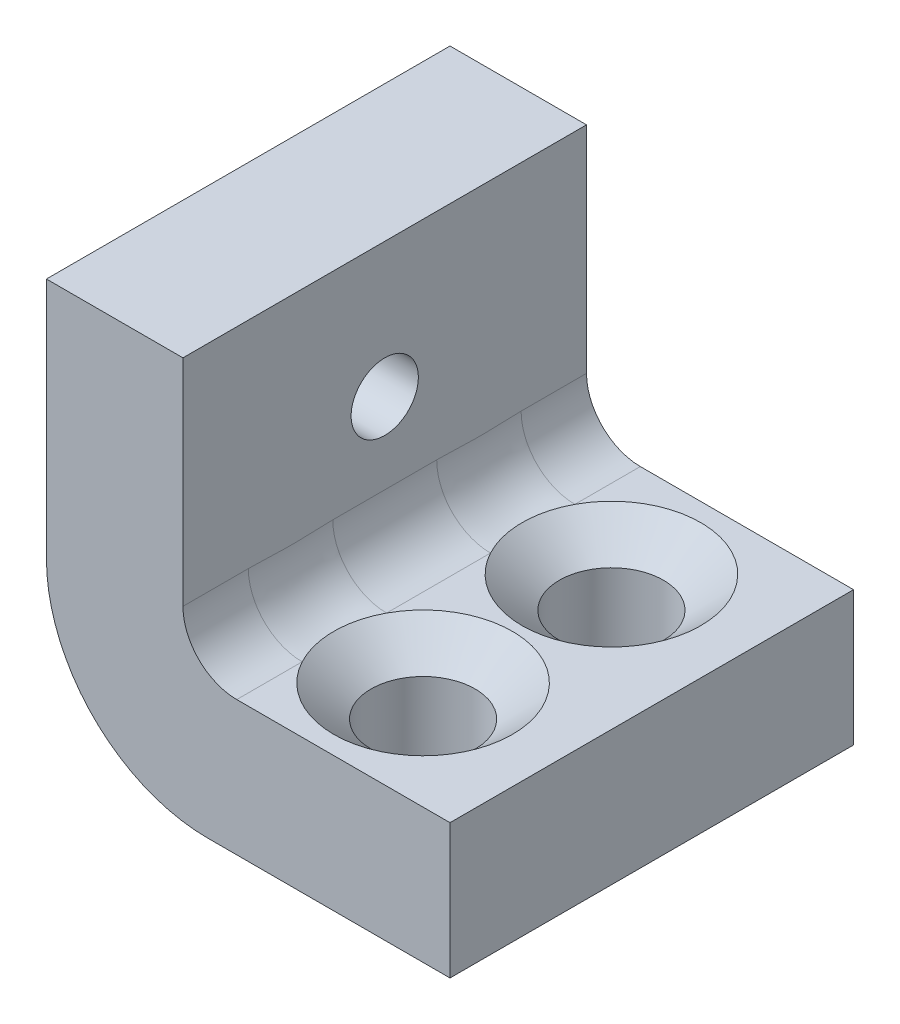
ISO-10303-21;
HEADER;
FILE_DESCRIPTION(('STEP AP214'),'2;1');
FILE_NAME('part.step','',(''),(''),'','','');
FILE_SCHEMA(('AUTOMOTIVE_DESIGN { 1 0 10303 214 1 1 1 1 }'));
ENDSEC;
DATA;
#1=APPLICATION_CONTEXT('core data for automotive mechanical design processes');
#2=APPLICATION_PROTOCOL_DEFINITION('international standard','automotive_design',2000,#1);
#3=PRODUCT_CONTEXT('',#1,'mechanical');
#4=PRODUCT('Part','Part','',(#3));
#5=PRODUCT_RELATED_PRODUCT_CATEGORY('part','',(#4));
#6=PRODUCT_DEFINITION_FORMATION('','',#4);
#7=PRODUCT_DEFINITION_CONTEXT('part definition',#1,'design');
#8=PRODUCT_DEFINITION('design','',#6,#7);
#9=PRODUCT_DEFINITION_SHAPE('','',#8);
#10=(LENGTH_UNIT() NAMED_UNIT(*) SI_UNIT(.MILLI.,.METRE.));
#11=(NAMED_UNIT(*) PLANE_ANGLE_UNIT() SI_UNIT($,.RADIAN.));
#12=(NAMED_UNIT(*) SI_UNIT($,.STERADIAN.) SOLID_ANGLE_UNIT());
#13=UNCERTAINTY_MEASURE_WITH_UNIT(LENGTH_MEASURE(1.E-05),#10,'distance_accuracy_value','');
#14=(GEOMETRIC_REPRESENTATION_CONTEXT(3) GLOBAL_UNCERTAINTY_ASSIGNED_CONTEXT((#13)) GLOBAL_UNIT_ASSIGNED_CONTEXT((#10,
#11,#12)) REPRESENTATION_CONTEXT('',''));
#15=CARTESIAN_POINT('',(0.,0.,0.));
#16=DIRECTION('',(0.,0.,1.));
#17=DIRECTION('',(1.,0.,0.));
#18=AXIS2_PLACEMENT_3D('',#15,#16,#17);
#19=CARTESIAN_POINT('',(0.,6.35,0.));
#20=DIRECTION('',(0.,-1.,0.));
#21=DIRECTION('',(0.,0.,-1.));
#22=AXIS2_PLACEMENT_3D('',#19,#20,#21);
#23=PLANE('',#22);
#24=DIRECTION('',(-1.,0.,0.));
#25=VECTOR('',#24,1.);
#26=CARTESIAN_POINT('',(0.,6.35,-19.05));
#27=LINE('',#26,#25);
#28=CARTESIAN_POINT('',(19.05,6.35,-19.05));
#29=VERTEX_POINT('',#28);
#30=CARTESIAN_POINT('',(8.98411348793028,6.35,-19.05));
#31=VERTEX_POINT('',#30);
#32=EDGE_CURVE('E184',#29,#31,#27,.T.);
#33=ORIENTED_EDGE('',*,*,#32,.T.);
#34=DIRECTION('',(0.,0.,-1.));
#35=VECTOR('',#34,1.);
#36=CARTESIAN_POINT('',(8.98411348793029,6.35,0.));
#37=LINE('',#36,#35);
#38=CARTESIAN_POINT('',(8.98411348793029,6.35,-15.9625401851452));
#39=VERTEX_POINT('',#38);
#40=EDGE_CURVE('E366',#31,#39,#37,.F.);
#41=ORIENTED_EDGE('',*,*,#40,.T.);
#42=CARTESIAN_POINT('',(12.7,6.35,-13.97));
#43=DIRECTION('',(0.,1.,0.));
#44=DIRECTION('',(0.,0.,1.));
#45=AXIS2_PLACEMENT_3D('',#42,#43,#44);
#46=CIRCLE('',#45,4.2164);
#47=CARTESIAN_POINT('',(8.98411348793029,6.35,-11.9774598148548));
#48=VERTEX_POINT('',#47);
#49=EDGE_CURVE('E324',#48,#39,#46,.T.);
#50=ORIENTED_EDGE('',*,*,#49,.F.);
#51=DIRECTION('',(0.,0.,-1.));
#52=VECTOR('',#51,1.);
#53=CARTESIAN_POINT('',(8.98411348793029,6.35,0.));
#54=LINE('',#53,#52);
#55=CARTESIAN_POINT('',(8.98411348793029,6.35,-7.07254018514517));
#56=VERTEX_POINT('',#55);
#57=EDGE_CURVE('E348',#48,#56,#54,.F.);
#58=ORIENTED_EDGE('',*,*,#57,.T.);
#59=CARTESIAN_POINT('',(12.7,6.35,-5.08));
#60=DIRECTION('',(0.,1.,0.));
#61=DIRECTION('',(0.,0.,1.));
#62=AXIS2_PLACEMENT_3D('',#59,#60,#61);
#63=CIRCLE('',#62,4.2164);
#64=CARTESIAN_POINT('',(8.98411348793029,6.35,-3.08745981485483));
#65=VERTEX_POINT('',#64);
#66=EDGE_CURVE('E209',#65,#56,#63,.T.);
#67=ORIENTED_EDGE('',*,*,#66,.F.);
#68=DIRECTION('',(0.,0.,-1.));
#69=VECTOR('',#68,1.);
#70=CARTESIAN_POINT('',(8.98411348793029,6.35,0.));
#71=LINE('',#70,#69);
#72=CARTESIAN_POINT('',(8.98411348793028,6.35,0.));
#73=VERTEX_POINT('',#72);
#74=EDGE_CURVE('E371',#65,#73,#71,.F.);
#75=ORIENTED_EDGE('',*,*,#74,.T.);
#76=DIRECTION('',(1.,0.,0.));
#77=VECTOR('',#76,1.);
#78=CARTESIAN_POINT('',(0.,6.35,0.));
#79=LINE('',#78,#77);
#80=CARTESIAN_POINT('',(19.05,6.35,0.));
#81=VERTEX_POINT('',#80);
#82=EDGE_CURVE('E177',#73,#81,#79,.T.);
#83=ORIENTED_EDGE('',*,*,#82,.T.);
#84=DIRECTION('',(0.,0.,-1.));
#85=VECTOR('',#84,1.);
#86=CARTESIAN_POINT('',(19.05,6.35,0.));
#87=LINE('',#86,#85);
#88=EDGE_CURVE('E180',#81,#29,#87,.T.);
#89=ORIENTED_EDGE('',*,*,#88,.T.);
#90=EDGE_LOOP('',(#33,#41,#50,#58,#67,#75,#83,#89));
#91=FACE_BOUND('',#90,.T.);
#92=ADVANCED_FACE('F41',(#91),#23,.F.);
#93=CARTESIAN_POINT('',(0.,6.35,0.));
#94=DIRECTION('',(1.,0.,0.));
#95=DIRECTION('',(0.,0.,-1.));
#96=AXIS2_PLACEMENT_3D('',#93,#94,#95);
#97=PLANE('',#96);
#98=CARTESIAN_POINT('',(0.,12.7,-9.525));
#99=DIRECTION('',(1.,0.,0.));
#100=DIRECTION('',(0.,0.,-1.));
#101=AXIS2_PLACEMENT_3D('',#98,#99,#100);
#102=CIRCLE('',#101,1.5875);
#103=CARTESIAN_POINT('',(0.,12.7,-11.1125));
#104=VERTEX_POINT('',#103);
#105=EDGE_CURVE('E319',#104,#104,#102,.T.);
#106=ORIENTED_EDGE('',*,*,#105,.T.);
#107=EDGE_LOOP('',(#106));
#108=FACE_BOUND('',#107,.T.);
#109=DIRECTION('',(0.,-1.,0.));
#110=VECTOR('',#109,1.);
#111=CARTESIAN_POINT('',(0.,6.35,-19.05));
#112=LINE('',#111,#110);
#113=CARTESIAN_POINT('',(0.,19.05,-19.05));
#114=VERTEX_POINT('',#113);
#115=CARTESIAN_POINT('',(0.,7.62,-19.05));
#116=VERTEX_POINT('',#115);
#117=EDGE_CURVE('E188',#114,#116,#112,.T.);
#118=ORIENTED_EDGE('',*,*,#117,.T.);
#119=DIRECTION('',(0.,0.,1.));
#120=VECTOR('',#119,1.);
#121=CARTESIAN_POINT('',(0.,7.62,0.));
#122=LINE('',#121,#120);
#123=CARTESIAN_POINT('',(0.,7.62,0.));
#124=VERTEX_POINT('',#123);
#125=EDGE_CURVE('E137',#116,#124,#122,.T.);
#126=ORIENTED_EDGE('',*,*,#125,.T.);
#127=DIRECTION('',(0.,-1.,0.));
#128=VECTOR('',#127,1.);
#129=CARTESIAN_POINT('',(0.,6.35,0.));
#130=LINE('',#129,#128);
#131=CARTESIAN_POINT('',(0.,19.05,0.));
#132=VERTEX_POINT('',#131);
#133=EDGE_CURVE('E130',#132,#124,#130,.T.);
#134=ORIENTED_EDGE('',*,*,#133,.F.);
#135=DIRECTION('',(0.,0.,1.));
#136=VECTOR('',#135,1.);
#137=CARTESIAN_POINT('',(0.,19.05,0.));
#138=LINE('',#137,#136);
#139=EDGE_CURVE('E135',#114,#132,#138,.T.);
#140=ORIENTED_EDGE('',*,*,#139,.F.);
#141=EDGE_LOOP('',(#118,#126,#134,#140));
#142=FACE_BOUND('',#141,.T.);
#143=ADVANCED_FACE('F133',(#108,#142),#97,.F.);
#144=CARTESIAN_POINT('',(0.,6.35,0.));
#145=DIRECTION('',(0.,0.,-1.));
#146=DIRECTION('',(-1.,0.,0.));
#147=AXIS2_PLACEMENT_3D('',#144,#145,#146);
#148=PLANE('',#147);
#149=ORIENTED_EDGE('',*,*,#133,.T.);
#150=CARTESIAN_POINT('',(7.62,7.62,0.));
#151=DIRECTION('',(0.,0.,-1.));
#152=DIRECTION('',(-1.,0.,0.));
#153=AXIS2_PLACEMENT_3D('',#150,#151,#152);
#154=CIRCLE('',#153,7.62);
#155=CARTESIAN_POINT('',(7.62,0.,0.));
#156=VERTEX_POINT('',#155);
#157=EDGE_CURVE('E64',#124,#156,#154,.F.);
#158=ORIENTED_EDGE('',*,*,#157,.T.);
#159=DIRECTION('',(1.,0.,0.));
#160=VECTOR('',#159,1.);
#161=CARTESIAN_POINT('',(0.,0.,0.));
#162=LINE('',#161,#160);
#163=CARTESIAN_POINT('',(19.05,0.,0.));
#164=VERTEX_POINT('',#163);
#165=EDGE_CURVE('E176',#156,#164,#162,.T.);
#166=ORIENTED_EDGE('',*,*,#165,.T.);
#167=DIRECTION('',(0.,-1.,0.));
#168=VECTOR('',#167,1.);
#169=CARTESIAN_POINT('',(19.05,6.35,0.));
#170=LINE('',#169,#168);
#171=EDGE_CURVE('E140',#81,#164,#170,.T.);
#172=ORIENTED_EDGE('',*,*,#171,.F.);
#173=ORIENTED_EDGE('',*,*,#82,.F.);
#174=CARTESIAN_POINT('',(8.98411348793029,8.89,0.));
#175=DIRECTION('',(0.,0.,-1.));
#176=DIRECTION('',(-1.,0.,0.));
#177=AXIS2_PLACEMENT_3D('',#174,#175,#176);
#178=CIRCLE('',#177,2.54);
#179=CARTESIAN_POINT('',(6.44411348793028,8.89,0.));
#180=VERTEX_POINT('',#179);
#181=EDGE_CURVE('E360',#73,#180,#178,.T.);
#182=ORIENTED_EDGE('',*,*,#181,.T.);
#183=DIRECTION('',(0.,-1.,0.));
#184=VECTOR('',#183,1.);
#185=CARTESIAN_POINT('',(6.44411348793028,19.05,0.));
#186=LINE('',#185,#184);
#187=CARTESIAN_POINT('',(6.44411348793028,19.05,0.));
#188=VERTEX_POINT('',#187);
#189=EDGE_CURVE('E146',#188,#180,#186,.T.);
#190=ORIENTED_EDGE('',*,*,#189,.F.);
#191=DIRECTION('',(1.,0.,0.));
#192=VECTOR('',#191,1.);
#193=CARTESIAN_POINT('',(0.,19.05,0.));
#194=LINE('',#193,#192);
#195=EDGE_CURVE('E143',#132,#188,#194,.T.);
#196=ORIENTED_EDGE('',*,*,#195,.F.);
#197=EDGE_LOOP('',(#149,#158,#166,#172,#173,#182,#190,#196));
#198=FACE_BOUND('',#197,.T.);
#199=ADVANCED_FACE('F144',(#198),#148,.F.);
#200=CARTESIAN_POINT('',(19.05,6.35,0.));
#201=DIRECTION('',(-1.,0.,0.));
#202=DIRECTION('',(0.,0.,1.));
#203=AXIS2_PLACEMENT_3D('',#200,#201,#202);
#204=PLANE('',#203);
#205=DIRECTION('',(0.,0.,-1.));
#206=VECTOR('',#205,1.);
#207=CARTESIAN_POINT('',(19.05,0.,0.));
#208=LINE('',#207,#206);
#209=CARTESIAN_POINT('',(19.05,0.,-19.05));
#210=VERTEX_POINT('',#209);
#211=EDGE_CURVE('E191',#164,#210,#208,.T.);
#212=ORIENTED_EDGE('',*,*,#211,.T.);
#213=DIRECTION('',(0.,-1.,0.));
#214=VECTOR('',#213,1.);
#215=CARTESIAN_POINT('',(19.05,6.35,-19.05));
#216=LINE('',#215,#214);
#217=EDGE_CURVE('E198',#29,#210,#216,.T.);
#218=ORIENTED_EDGE('',*,*,#217,.F.);
#219=ORIENTED_EDGE('',*,*,#88,.F.);
#220=ORIENTED_EDGE('',*,*,#171,.T.);
#221=EDGE_LOOP('',(#212,#218,#219,#220));
#222=FACE_BOUND('',#221,.T.);
#223=ADVANCED_FACE('F412',(#222),#204,.F.);
#224=CARTESIAN_POINT('',(0.,6.35,-19.05));
#225=DIRECTION('',(0.,0.,1.));
#226=DIRECTION('',(1.,0.,0.));
#227=AXIS2_PLACEMENT_3D('',#224,#225,#226);
#228=PLANE('',#227);
#229=DIRECTION('',(-1.,0.,0.));
#230=VECTOR('',#229,1.);
#231=CARTESIAN_POINT('',(0.,0.,-19.05));
#232=LINE('',#231,#230);
#233=CARTESIAN_POINT('',(7.62,0.,-19.05));
#234=VERTEX_POINT('',#233);
#235=EDGE_CURVE('E181',#210,#234,#232,.T.);
#236=ORIENTED_EDGE('',*,*,#235,.T.);
#237=CARTESIAN_POINT('',(7.62,7.62,-19.05));
#238=DIRECTION('',(0.,0.,1.));
#239=DIRECTION('',(1.,0.,0.));
#240=AXIS2_PLACEMENT_3D('',#237,#238,#239);
#241=CIRCLE('',#240,7.62);
#242=EDGE_CURVE('E11',#234,#116,#241,.F.);
#243=ORIENTED_EDGE('',*,*,#242,.T.);
#244=ORIENTED_EDGE('',*,*,#117,.F.);
#245=DIRECTION('',(-1.,0.,0.));
#246=VECTOR('',#245,1.);
#247=CARTESIAN_POINT('',(0.,19.05,-19.05));
#248=LINE('',#247,#246);
#249=CARTESIAN_POINT('',(6.44411348793028,19.05,-19.05));
#250=VERTEX_POINT('',#249);
#251=EDGE_CURVE('E155',#250,#114,#248,.T.);
#252=ORIENTED_EDGE('',*,*,#251,.F.);
#253=DIRECTION('',(0.,-1.,0.));
#254=VECTOR('',#253,1.);
#255=CARTESIAN_POINT('',(6.44411348793028,19.05,-19.05));
#256=LINE('',#255,#254);
#257=CARTESIAN_POINT('',(6.44411348793028,8.89,-19.05));
#258=VERTEX_POINT('',#257);
#259=EDGE_CURVE('E170',#250,#258,#256,.T.);
#260=ORIENTED_EDGE('',*,*,#259,.T.);
#261=CARTESIAN_POINT('',(8.98411348793029,8.89,-19.05));
#262=DIRECTION('',(0.,0.,1.));
#263=DIRECTION('',(1.,0.,0.));
#264=AXIS2_PLACEMENT_3D('',#261,#262,#263);
#265=CIRCLE('',#264,2.54);
#266=EDGE_CURVE('E363',#258,#31,#265,.T.);
#267=ORIENTED_EDGE('',*,*,#266,.T.);
#268=ORIENTED_EDGE('',*,*,#32,.F.);
#269=ORIENTED_EDGE('',*,*,#217,.T.);
#270=EDGE_LOOP('',(#236,#243,#244,#252,#260,#267,#268,#269));
#271=FACE_BOUND('',#270,.T.);
#272=ADVANCED_FACE('F391',(#271),#228,.F.);
#273=CARTESIAN_POINT('',(0.,0.,0.));
#274=DIRECTION('',(0.,-1.,0.));
#275=DIRECTION('',(0.,0.,-1.));
#276=AXIS2_PLACEMENT_3D('',#273,#274,#275);
#277=PLANE('',#276);
#278=CARTESIAN_POINT('',(12.7,0.,-13.97));
#279=DIRECTION('',(0.,-1.,0.));
#280=DIRECTION('',(0.,0.,-1.));
#281=AXIS2_PLACEMENT_3D('',#278,#279,#280);
#282=CIRCLE('',#281,2.45745);
#283=CARTESIAN_POINT('',(12.7,0.,-16.42745));
#284=VERTEX_POINT('',#283);
#285=EDGE_CURVE('E205',#284,#284,#282,.T.);
#286=ORIENTED_EDGE('',*,*,#285,.F.);
#287=EDGE_LOOP('',(#286));
#288=FACE_BOUND('',#287,.T.);
#289=CARTESIAN_POINT('',(12.7,0.,-5.08));
#290=DIRECTION('',(0.,-1.,0.));
#291=DIRECTION('',(0.,0.,-1.));
#292=AXIS2_PLACEMENT_3D('',#289,#290,#291);
#293=CIRCLE('',#292,2.45745);
#294=CARTESIAN_POINT('',(12.7,0.,-7.53745));
#295=VERTEX_POINT('',#294);
#296=EDGE_CURVE('E157',#295,#295,#293,.T.);
#297=ORIENTED_EDGE('',*,*,#296,.F.);
#298=EDGE_LOOP('',(#297));
#299=FACE_BOUND('',#298,.T.);
#300=ORIENTED_EDGE('',*,*,#165,.F.);
#301=DIRECTION('',(0.,0.,1.));
#302=VECTOR('',#301,1.);
#303=CARTESIAN_POINT('',(7.62,0.,-19.05));
#304=LINE('',#303,#302);
#305=EDGE_CURVE('E50',#156,#234,#304,.F.);
#306=ORIENTED_EDGE('',*,*,#305,.T.);
#307=ORIENTED_EDGE('',*,*,#235,.F.);
#308=ORIENTED_EDGE('',*,*,#211,.F.);
#309=EDGE_LOOP('',(#300,#306,#307,#308));
#310=FACE_BOUND('',#309,.T.);
#311=ADVANCED_FACE('F280',(#288,#299,#310),#277,.T.);
#312=CARTESIAN_POINT('',(6.44411348793028,19.05,0.));
#313=DIRECTION('',(-1.,0.,0.));
#314=DIRECTION('',(0.,0.,1.));
#315=AXIS2_PLACEMENT_3D('',#312,#313,#314);
#316=PLANE('',#315);
#317=CARTESIAN_POINT('',(6.44411348793028,12.7,-9.525));
#318=DIRECTION('',(1.,0.,0.));
#319=DIRECTION('',(0.,0.,-1.));
#320=AXIS2_PLACEMENT_3D('',#317,#318,#319);
#321=CIRCLE('',#320,1.5875);
#322=CARTESIAN_POINT('',(6.44411348793028,12.7,-11.1125));
#323=VERTEX_POINT('',#322);
#324=EDGE_CURVE('E313',#323,#323,#321,.T.);
#325=ORIENTED_EDGE('',*,*,#324,.F.);
#326=EDGE_LOOP('',(#325));
#327=FACE_BOUND('',#326,.T.);
#328=ORIENTED_EDGE('',*,*,#189,.T.);
#329=DIRECTION('',(0.,0.,-1.));
#330=VECTOR('',#329,1.);
#331=CARTESIAN_POINT('',(6.44411348793028,8.89,-19.05));
#332=LINE('',#331,#330);
#333=CARTESIAN_POINT('',(6.44411348793028,8.89,-3.08745981485483));
#334=VERTEX_POINT('',#333);
#335=EDGE_CURVE('E374',#180,#334,#332,.T.);
#336=ORIENTED_EDGE('',*,*,#335,.T.);
#337=CARTESIAN_POINT('',(6.44411348793028,8.697989856116,-1.46360304315167));
#338=CARTESIAN_POINT('',(6.44411348793028,5.46681359420844,-2.39343303187041));
#339=CARTESIAN_POINT('',(9.67837876127882,6.35,-2.13928001167927));
#340=CARTESIAN_POINT('',(6.44411348793028,8.71771878776599,-1.53215888614572));
#341=CARTESIAN_POINT('',(6.44411348793029,5.50786415533465,-2.39299366091433));
#342=CARTESIAN_POINT('',(9.65052120552175,6.35,-2.16790885081572));
#343=CARTESIAN_POINT('',(6.44411348793028,8.73559547822837,-1.601223639919));
#344=CARTESIAN_POINT('',(6.44411348793028,5.54991934323192,-2.39709253912872));
#345=CARTESIAN_POINT('',(9.62208069225673,6.35,-2.19794045090695));
#346=CARTESIAN_POINT('',(6.44411348793028,8.76790941129032,-1.7401155198864));
#347=CARTESIAN_POINT('',(6.44411348793028,5.63437939896218,-2.41421016955312));
#348=CARTESIAN_POINT('',(9.56422956688906,6.35,-2.26099161068791));
#349=CARTESIAN_POINT('',(6.44411348793028,8.78234855075805,-1.80994220328937));
#350=CARTESIAN_POINT('',(6.44411348793029,5.67677095740929,-2.42709088222888));
#351=CARTESIAN_POINT('',(9.53481950004227,6.35,-2.29400950856902));
#352=CARTESIAN_POINT('',(6.44411348793028,8.82084105262265,-2.01977856836914));
#353=CARTESIAN_POINT('',(6.44411348793028,5.80184331334354,-2.47799363308509));
#354=CARTESIAN_POINT('',(9.44560152887744,6.35,-2.39760962507926));
#355=CARTESIAN_POINT('',(6.44411348793028,8.84021117169214,-2.16065449819978));
#356=CARTESIAN_POINT('',(6.44411348793029,5.88460774615264,-2.52829092373706));
#357=CARTESIAN_POINT('',(9.38459727182838,6.35,-2.47294701505994));
#358=CARTESIAN_POINT('',(6.44411348793028,8.8687334897177,-2.44258653007154));
#359=CARTESIAN_POINT('',(6.44411348793029,6.04159569309455,-2.65825224747978));
#360=CARTESIAN_POINT('',(9.2617236898041,6.35,-2.63730688591813));
#361=CARTESIAN_POINT('',(6.44411348793028,8.87793993940967,-2.58363761246227));
#362=CARTESIAN_POINT('',(6.44411348793028,6.11611817478295,-2.73698977729465));
#363=CARTESIAN_POINT('',(9.19986076016729,6.35,-2.72625379356983));
#364=CARTESIAN_POINT('',(6.44411348793028,8.88886381014993,-2.86613105607985));
#365=CARTESIAN_POINT('',(6.44411348793028,6.25387247455703,-2.91902382475803));
#366=CARTESIAN_POINT('',(9.07744037538057,6.35,-2.91940497802193));
#367=CARTESIAN_POINT('',(6.44411348793028,8.89057376857674,-3.00757366701336));
#368=CARTESIAN_POINT('',(6.44411348793028,6.3174853060186,-3.02187313371647));
#369=CARTESIAN_POINT('',(9.01688428078963,6.35,-3.02362435170853));
#370=CARTESIAN_POINT('',(6.44411348793028,8.88898576752956,-3.3126066311326));
#371=CARTESIAN_POINT('',(6.44411348793029,6.44043529201545,-3.26458598690141));
#372=CARTESIAN_POINT('',(8.89121693961137,6.35,-3.26546449945892));
#373=CARTESIAN_POINT('',(6.44411348793028,8.88485926357605,-3.47618714805479));
#374=CARTESIAN_POINT('',(6.44411348793029,6.49840760013655,-3.40800634247278));
#375=CARTESIAN_POINT('',(8.82688357932838,6.35,-3.40576040857976));
#376=CARTESIAN_POINT('',(6.44411348793028,8.87406328339418,-3.80319812902663));
#377=CARTESIAN_POINT('',(6.44411348793029,6.59623014006103,-3.71413631614766));
#378=CARTESIAN_POINT('',(8.71031018075851,6.35,-3.70655294328914));
#379=CARTESIAN_POINT('',(6.44411348793028,8.8673944743926,-3.96662862117862));
#380=CARTESIAN_POINT('',(6.44411348793028,6.63670304571326,-3.87719908667808));
#381=CARTESIAN_POINT('',(8.65806697519262,6.35,-3.86704426120451));
#382=CARTESIAN_POINT('',(6.44411348793028,8.85510013030521,-4.2941978295616));
#383=CARTESIAN_POINT('',(6.44411348793028,6.70026992882971,-4.2163469273709));
#384=CARTESIAN_POINT('',(8.57169184993698,6.35,-4.20506822006453));
#385=CARTESIAN_POINT('',(6.44411348793028,8.84947890287386,-4.4583367484758));
#386=CARTESIAN_POINT('',(6.44411348793028,6.72376261180242,-4.39342440836769));
#387=CARTESIAN_POINT('',(8.53763368194659,6.35,-4.38266685856457));
#388=CARTESIAN_POINT('',(6.44411348793028,8.84376950437924,-4.70462952776452));
#389=CARTESIAN_POINT('',(6.44411348793029,6.74647649324318,-4.66348332946692));
#390=CARTESIAN_POINT('',(8.50397427557256,6.35,-4.65587046923097));
#391=CARTESIAN_POINT('',(6.44411348793028,8.8423201030268,-4.7867495920851));
#392=CARTESIAN_POINT('',(6.44411348793029,6.75198747633932,-4.75425510245995));
#393=CARTESIAN_POINT('',(8.49565915554169,6.35,-4.74808239554372));
#394=CARTESIAN_POINT('',(6.44411348793028,8.84047003486115,-4.95100025472701));
#395=CARTESIAN_POINT('',(6.44411348793028,6.75893207639496,-4.93636344927947));
#396=CARTESIAN_POINT('',(8.48511918312057,6.35,-4.93356370088561));
#397=CARTESIAN_POINT('',(6.44411348793028,8.8400693516555,-5.03313085286363));
#398=CARTESIAN_POINT('',(6.44411348793028,6.76037980749502,-5.027881985884));
#399=CARTESIAN_POINT('',(8.48289423553526,6.35,-5.02683306336314));
#400=CARTESIAN_POINT('',(6.44411348793028,8.84055696851345,-5.27988102847582));
#401=CARTESIAN_POINT('',(6.44411348793028,6.75863455547197,-5.30239925409156));
#402=CARTESIAN_POINT('',(8.48558491925324,6.35,-5.30676821104715));
#403=CARTESIAN_POINT('',(6.44411348793028,8.84314410348014,-5.44449905184973));
#404=CARTESIAN_POINT('',(6.44411348793028,6.74929355369448,-5.48600625861273));
#405=CARTESIAN_POINT('',(8.49991691376882,6.35,-5.4931510790997));
#406=CARTESIAN_POINT('',(6.44411348793028,8.85173150149063,-5.77363480462799));
#407=CARTESIAN_POINT('',(6.44411348793029,6.71420108422892,-5.84424864536793));
#408=CARTESIAN_POINT('',(8.55147991020078,6.35,-5.85552080886446));
#409=CARTESIAN_POINT('',(6.44411348793028,8.85773187090217,-5.93815253074678));
#410=CARTESIAN_POINT('',(6.44411348793029,6.68816942114092,-6.02020477577557));
#411=CARTESIAN_POINT('',(8.58871162575152,6.35,-6.03150734640377));
#412=CARTESIAN_POINT('',(6.44411348793028,8.87029128641753,-6.26671943592889));
#413=CARTESIAN_POINT('',(6.44411348793029,6.61934204304359,-6.3563803093226));
#414=CARTESIAN_POINT('',(8.68065453069913,6.35,-6.36565803287705));
#415=CARTESIAN_POINT('',(6.44411348793028,8.87684878587697,-6.43076868464577));
#416=CARTESIAN_POINT('',(6.44411348793028,6.57609322722001,-6.51750311620833));
#417=CARTESIAN_POINT('',(8.73531841938687,6.35,-6.52386886156852));
#418=CARTESIAN_POINT('',(6.44411348793028,8.88680919734044,-6.75906180393958));
#419=CARTESIAN_POINT('',(6.44411348793028,6.47260476382008,-6.81874111231477));
#420=CARTESIAN_POINT('',(8.85589053061148,6.35,-6.81966663300018));
#421=CARTESIAN_POINT('',(6.44411348793028,8.89021066960875,-6.92330572915064));
#422=CARTESIAN_POINT('',(6.44411348793028,6.41171630906729,-6.95911711409837));
#423=CARTESIAN_POINT('',(8.92180386877406,6.35,-6.95724413913715));
#424=CARTESIAN_POINT('',(6.44411348793028,8.88976832630742,-7.25259859227135));
#425=CARTESIAN_POINT('',(6.44411348793029,6.2735230476454,-7.21327154915665));
#426=CARTESIAN_POINT('',(9.05927662592298,6.35,-7.2117145752753));
#427=CARTESIAN_POINT('',(6.44411348793028,8.88589137904359,-7.41764778367679));
#428=CARTESIAN_POINT('',(6.44411348793028,6.19546857462044,-7.32656925905083));
#429=CARTESIAN_POINT('',(9.13086043602905,6.35,-7.32851025517751));
#430=CARTESIAN_POINT('',(6.44411348793028,8.86670767234722,-7.74688026068902));
#431=CARTESIAN_POINT('',(6.44411348793028,6.02629253638863,-7.5189126852739));
#432=CARTESIAN_POINT('',(9.27442680862313,6.35,-7.54170304149073));
#433=CARTESIAN_POINT('',(6.44411348793028,8.85142027217674,-7.91106453913455));
#434=CARTESIAN_POINT('',(6.44411348793028,5.93462194295729,-7.59710339163861));
#435=CARTESIAN_POINT('',(9.34640849098765,6.35,-7.63813434351209));
#436=CARTESIAN_POINT('',(6.44411348793028,8.80510896297253,-8.24017260004227));
#437=CARTESIAN_POINT('',(6.44411348793029,5.74262186192993,-7.71372477398719));
#438=CARTESIAN_POINT('',(9.4884714767594,6.35,-7.81443767128535));
#439=CARTESIAN_POINT('',(6.44411348793028,8.77382738590895,-8.40506321283103));
#440=CARTESIAN_POINT('',(6.44411348793029,5.64194970456761,-7.74998429822575));
#441=CARTESIAN_POINT('',(9.55850121406043,6.35,-7.89400739085886));
#442=CARTESIAN_POINT('',(6.44411348793028,8.71214573880727,-8.64921467912124));
#443=CARTESIAN_POINT('',(6.44411348793028,5.49481520140343,-7.76829572813521));
#444=CARTESIAN_POINT('',(9.65931205026001,6.35,-8.00141527600489));
#445=CARTESIAN_POINT('',(6.44411348793028,8.68902487969883,-8.7303286899219));
#446=CARTESIAN_POINT('',(6.44411348793029,5.44566378716119,-7.76807489527637));
#447=CARTESIAN_POINT('',(9.69231130114558,6.35,-8.03531819539827));
#448=CARTESIAN_POINT('',(6.44411348793028,8.63742632198307,-8.89092047881156));
#449=CARTESIAN_POINT('',(6.44411348793028,5.35023534599425,-7.75493692863855));
#450=CARTESIAN_POINT('',(9.75661199385097,6.35,-8.09936186889254));
#451=CARTESIAN_POINT('',(6.44411348793028,8.60894314805742,-8.97039649153713));
#452=CARTESIAN_POINT('',(6.44411348793028,5.30403909227096,-7.74177887219386));
#453=CARTESIAN_POINT('',(9.78791165780408,6.35,-8.12949872476841));
#454=CARTESIAN_POINT('',(6.44411348793028,8.57759316531846,-9.04878012551285));
#455=CARTESIAN_POINT('',(6.44411348793028,5.26078410787421,-7.72228267030476));
#456=CARTESIAN_POINT('',(9.81823095386947,6.35,-8.15789475530986));
#457=(BOUNDED_SURFACE() B_SPLINE_SURFACE(3,2,((#337,#338,#339),(#340,#341,#342),(#343,#344,
#345),(#346,#347,#348),(#349,#350,#351),(#352,#353,#354),(#355,#356,#357),(#358,#359,#360),
(#361,#362,#363),(#364,#365,#366),(#367,#368,#369),(#370,#371,#372),(#373,#374,#375),(#376,#377,
#378),(#379,#380,#381),(#382,#383,#384),(#385,#386,#387),(#388,#389,#390),(#391,#392,#393),
(#394,#395,#396),(#397,#398,#399),(#400,#401,#402),(#403,#404,#405),(#406,#407,#408),(#409,#410,
#411),(#412,#413,#414),(#415,#416,#417),(#418,#419,#420),(#421,#422,#423),(#424,#425,#426),
(#427,#428,#429),(#430,#431,#432),(#433,#434,#435),(#436,#437,#438),(#439,#440,#441),(#442,#443,
#444),(#445,#446,#447),(#448,#449,#450),(#451,#452,#453),(#454,#455,#456)),.UNSPECIFIED.,.F.,
.F.,.F.) B_SPLINE_SURFACE_WITH_KNOTS((4,2,2,2,2,2,2,2,2,2,2,2,2,2,2,2,2,2,2,4),(3,3),(0.,
0.213951871199414,0.42778540697161,0.85387112186737,1.27767134963422,1.70189336720445,
2.19272991676676,2.68343773508885,3.17612084835543,3.42251281716606,3.66890093461849,
4.1627569389786,4.65662833437656,5.14917089414034,5.64193803465846,6.13695371388673,
6.63113144068089,7.13353375963869,7.38640033873612,7.63952652753065),(0.,1.),
.UNSPECIFIED.) GEOMETRIC_REPRESENTATION_ITEM() RATIONAL_B_SPLINE_SURFACE(((1.,0.602771604845944,
1.),(1.,0.607320746602194,1.),(1.,0.61191282319707,1.),(1.,0.621148267068397,1.),(1.,
0.625791604571522,1.),(1.,0.63971991977388,1.),(1.,0.649037297506673,1.),(1.,0.667410143857021,
1.),(1.,0.676466749256928,1.),(1.,0.694050401341412,1.),(1.,0.702576912008512,1.),(1.,
0.719981738585506,1.),(1.,0.728705053948812,1.),(1.,0.744284462725823,1.),(1.,0.751141045254038,
1.),(1.,0.762376546499419,1.),(1.,0.766745380527265,1.),(1.,0.771049539049767,1.),(1.,
0.772109403140608,1.),(1.,0.773451759021652,1.),(1.,0.773734262962719,1.),(1.,0.773392927229875,
1.),(1.,0.77157378653446,1.),(1.,0.764966727915945,1.),(1.,0.760178717472575,1.),(1.,
0.748178686537059,1.),(1.,0.740973222873616,1.),(1.,0.724779925958069,1.),(1.,0.715791281510957,
1.),(1.,0.696632012051051,1.),(1.,0.686456180718917,1.),(1.,0.665553075123509,1.),(1.,
0.65482676349044,1.),(1.,0.633116582777238,1.),(1.,0.622131398242104,1.),(1.,0.605901591820965,
1.),(1.,0.600515719994942,1.),(1.,0.589882823965713,1.),(1.,0.584635947989687,1.),(1.,
0.579485675782558,1.))) REPRESENTATION_ITEM('') SURFACE());
#458=CARTESIAN_POINT('',(6.44411348793028,8.697989856116,-1.46360304315167));
#459=CARTESIAN_POINT('',(6.44411348793028,8.71771878776599,-1.53215888614572));
#460=CARTESIAN_POINT('',(6.44411348793028,8.73559547822837,-1.601223639919));
#461=CARTESIAN_POINT('',(6.44411348793028,8.76790941129032,-1.7401155198864));
#462=CARTESIAN_POINT('',(6.44411348793028,8.78234855075806,-1.80994220328937));
#463=CARTESIAN_POINT('',(6.44411348793028,8.82084105262265,-2.01977856836914));
#464=CARTESIAN_POINT('',(6.44411348793028,8.84021117169214,-2.16065449819978));
#465=CARTESIAN_POINT('',(6.44411348793028,8.8687334897177,-2.44258653007154));
#466=CARTESIAN_POINT('',(6.44411348793028,8.87793993940967,-2.58363761246227));
#467=CARTESIAN_POINT('',(6.44411348793028,8.88886381014993,-2.86613105607985));
#468=CARTESIAN_POINT('',(6.44411348793028,8.89057376857674,-3.00757366701336));
#469=CARTESIAN_POINT('',(6.44411348793028,8.88898576752956,-3.3126066311326));
#470=CARTESIAN_POINT('',(6.44411348793028,8.88485926357605,-3.47618714805479));
#471=CARTESIAN_POINT('',(6.44411348793028,8.87406328339418,-3.80319812902663));
#472=CARTESIAN_POINT('',(6.44411348793028,8.8673944743926,-3.96662862117862));
#473=CARTESIAN_POINT('',(6.44411348793028,8.85510013030521,-4.2941978295616));
#474=CARTESIAN_POINT('',(6.44411348793028,8.84947890287386,-4.4583367484758));
#475=CARTESIAN_POINT('',(6.44411348793028,8.84376950437924,-4.70462952776452));
#476=CARTESIAN_POINT('',(6.44411348793028,8.8423201030268,-4.7867495920851));
#477=CARTESIAN_POINT('',(6.44411348793028,8.84047003486115,-4.95100025472701));
#478=CARTESIAN_POINT('',(6.44411348793028,8.8400693516555,-5.03313085286363));
#479=CARTESIAN_POINT('',(6.44411348793028,8.84055696851345,-5.27988102847582));
#480=CARTESIAN_POINT('',(6.44411348793028,8.84314410348014,-5.44449905184973));
#481=CARTESIAN_POINT('',(6.44411348793028,8.85173150149063,-5.77363480462799));
#482=CARTESIAN_POINT('',(6.44411348793028,8.85773187090217,-5.93815253074678));
#483=CARTESIAN_POINT('',(6.44411348793028,8.87029128641753,-6.26671943592889));
#484=CARTESIAN_POINT('',(6.44411348793028,8.87684878587697,-6.43076868464577));
#485=CARTESIAN_POINT('',(6.44411348793028,8.88680919734045,-6.75906180393958));
#486=CARTESIAN_POINT('',(6.44411348793028,8.89021066960875,-6.92330572915064));
#487=CARTESIAN_POINT('',(6.44411348793028,8.88976832630742,-7.25259859227135));
#488=CARTESIAN_POINT('',(6.44411348793028,8.8858913790436,-7.41764778367679));
#489=CARTESIAN_POINT('',(6.44411348793028,8.86670767234722,-7.74688026068902));
#490=CARTESIAN_POINT('',(6.44411348793028,8.85142027217674,-7.91106453913456));
#491=CARTESIAN_POINT('',(6.44411348793028,8.80510896297253,-8.24017260004227));
#492=CARTESIAN_POINT('',(6.44411348793028,8.77382738590894,-8.40506321283103));
#493=CARTESIAN_POINT('',(6.44411348793028,8.71214573880727,-8.64921467912124));
#494=CARTESIAN_POINT('',(6.44411348793028,8.68902487969883,-8.7303286899219));
#495=CARTESIAN_POINT('',(6.44411348793028,8.63742632198307,-8.89092047881156));
#496=CARTESIAN_POINT('',(6.44411348793028,8.60894314805742,-8.97039649153713));
#497=CARTESIAN_POINT('',(6.44411348793028,8.57759316531846,-9.04878012551285));
#498=B_SPLINE_CURVE_WITH_KNOTS('',3,(#458,#459,#460,#461,#462,#463,#464,#465,#466,#467,#468,
#469,#470,#471,#472,#473,#474,#475,#476,#477,#478,#479,#480,#481,#482,#483,#484,#485,#486,#487,
#488,#489,#490,#491,#492,#493,#494,#495,#496,#497),.UNSPECIFIED.,.F.,.F.,(4,2,2,2,2,2,2,2,2,2,2,
2,2,2,2,2,2,2,2,4),(0.,0.213951871199414,0.42778540697161,0.85387112186737,1.27767134963422,
1.70189336720445,2.19272991676676,2.68343773508885,3.17612084835543,3.42251281716606,
3.66890093461849,4.1627569389786,4.65662833437656,5.14917089414034,5.64193803465846,
6.13695371388673,6.63113144068089,7.13353375963869,7.38640033873612,7.63952652753065),.UNSPECIFIED.);
#499=CARTESIAN_POINT('',(6.44411348793028,8.89,-7.07254018514517));
#500=VERTEX_POINT('',#499);
#501=EDGE_CURVE('E354',#334,#500,#498,.T.);
#502=ORIENTED_EDGE('',*,*,#501,.T.);
#503=DIRECTION('',(0.,0.,-1.));
#504=VECTOR('',#503,1.);
#505=CARTESIAN_POINT('',(6.44411348793028,8.89,-19.05));
#506=LINE('',#505,#504);
#507=CARTESIAN_POINT('',(6.44411348793028,8.89,-11.9774598148548));
#508=VERTEX_POINT('',#507);
#509=EDGE_CURVE('E222',#500,#508,#506,.T.);
#510=ORIENTED_EDGE('',*,*,#509,.T.);
#511=CARTESIAN_POINT('',(6.44411348793028,8.697989856116,-10.3536030431517));
#512=CARTESIAN_POINT('',(6.44411348793028,5.46681358513179,-11.283433027151));
#513=CARTESIAN_POINT('',(9.67837876646365,6.35,-11.0292800063518));
#514=CARTESIAN_POINT('',(6.44411348793028,8.7177187877632,-10.4221588861358));
#515=CARTESIAN_POINT('',(6.44411348793029,5.50786415202674,-11.2829936591859));
#516=CARTESIAN_POINT('',(9.65052120743847,6.35,-11.0579088488462));
#517=CARTESIAN_POINT('',(6.44411348793028,8.73559547822324,-10.491223639899));
#518=CARTESIAN_POINT('',(6.44411348793028,5.54991934232445,-11.2870925386559));
#519=CARTESIAN_POINT('',(9.62208069279106,6.35,-11.0879404503575));
#520=CARTESIAN_POINT('',(6.44411348793028,8.7679094112814,-10.630115519846));
#521=CARTESIAN_POINT('',(6.44411348793029,5.63437939979856,-11.304210170003));
#522=CARTESIAN_POINT('',(9.56422956638581,6.35,-11.1509916112035));
#523=CARTESIAN_POINT('',(6.44411348793028,8.78234855074769,-10.6999422032388));
#524=CARTESIAN_POINT('',(6.44411348793029,5.67677095767358,-11.3170908823755));
#525=CARTESIAN_POINT('',(9.53481949988286,6.35,-11.1840095087304));
#526=CARTESIAN_POINT('',(6.44411348793028,8.82084105260949,-10.9097785682883));
#527=CARTESIAN_POINT('',(6.44411348793029,5.80184331273005,-11.3679936327589));
#528=CARTESIAN_POINT('',(9.44560152927367,6.35,-11.2876096246663));
#529=CARTESIAN_POINT('',(6.44411348793028,8.84021117167895,-11.0506544980988));
#530=CARTESIAN_POINT('',(6.44411348793029,5.88460774594995,-11.4182909236237));
#531=CARTESIAN_POINT('',(9.38459727196682,6.35,-11.3629470149085));
#532=CARTESIAN_POINT('',(6.44411348793028,8.86873348971042,-11.3325865299703));
#533=CARTESIAN_POINT('',(6.44411348793028,6.04159569318102,-11.5482522474999));
#534=CARTESIAN_POINT('',(9.26172368975054,6.35,-11.5273068859563));
#535=CARTESIAN_POINT('',(6.44411348793028,8.87793993940548,-11.4736376123812));
#536=CARTESIAN_POINT('',(6.44411348793028,6.11611817477725,-11.6269897772631));
#537=CARTESIAN_POINT('',(9.19986076017737,6.35,-11.616253793542));
#538=CARTESIAN_POINT('',(6.44411348793028,8.88886381014943,-11.7561310560392));
#539=CARTESIAN_POINT('',(6.44411348793028,6.25387247450253,-11.8090238247092));
#540=CARTESIAN_POINT('',(9.07744037542505,6.35,-11.8094049779637));
#541=CARTESIAN_POINT('',(6.44411348793028,8.89057376857684,-11.8975736669931));
#542=CARTESIAN_POINT('',(6.44411348793028,6.31748530600113,-11.9118731336964));
#543=CARTESIAN_POINT('',(9.01688428080478,6.35,-11.9136243516859));
#544=CARTESIAN_POINT('',(6.44411348793028,8.88898576752946,-12.2026066311514));
#545=CARTESIAN_POINT('',(6.44411348793028,6.44043529203502,-12.1545859869237));
#546=CARTESIAN_POINT('',(8.89121693959354,6.35,-12.1554644994857));
#547=CARTESIAN_POINT('',(6.44411348793028,8.8848592635751,-12.3661871480924));
#548=CARTESIAN_POINT('',(6.44411348793028,6.49840760015262,-12.2980063425079));
#549=CARTESIAN_POINT('',(8.8268835793112,6.35,-12.2957604086159));
#550=CARTESIAN_POINT('',(6.44411348793028,8.8740632833914,-12.6931981291018));
#551=CARTESIAN_POINT('',(6.44411348793028,6.59623014007859,-12.6041363162175));
#552=CARTESIAN_POINT('',(8.71031018073553,6.35,-12.5965529433566));
#553=CARTESIAN_POINT('',(6.44411348793028,8.86739447438885,-12.8566286212726));
#554=CARTESIAN_POINT('',(6.44411348793029,6.63670304573549,-12.7671990867694));
#555=CARTESIAN_POINT('',(8.6580669751632,6.35,-12.757044261294));
#556=CARTESIAN_POINT('',(6.44411348793028,8.85510013030189,-13.1841978296556));
#557=CARTESIAN_POINT('',(6.44411348793029,6.7002699288456,-13.1063469274815));
#558=CARTESIAN_POINT('',(8.57169184991475,6.35,-13.0950682201772));
#559=CARTESIAN_POINT('',(6.44411348793028,8.84947890287171,-13.348336748551));
#560=CARTESIAN_POINT('',(6.44411348793028,6.7237626118112,-13.2834244084728));
#561=CARTESIAN_POINT('',(8.53763368193383,6.35,-13.2726668586748));
#562=CARTESIAN_POINT('',(6.44411348793028,8.84376950437835,-13.5946295278115));
#563=CARTESIAN_POINT('',(6.44411348793029,6.74647649324638,-13.553483329505));
#564=CARTESIAN_POINT('',(8.50397427556769,6.35,-13.5458704692672));
#565=CARTESIAN_POINT('',(6.44411348793028,8.84232010302626,-13.6767495921227));
#566=CARTESIAN_POINT('',(6.44411348793029,6.75198747634147,-13.644255102466));
#567=CARTESIAN_POINT('',(8.49565915553841,6.35,-13.6380823955435));
#568=CARTESIAN_POINT('',(6.44411348793028,8.84047003486106,-13.8410002547458));
#569=CARTESIAN_POINT('',(6.44411348793029,6.75893207639504,-13.8263634493328));
#570=CARTESIAN_POINT('',(8.48511918312045,6.35,-13.8235637009457));
#571=CARTESIAN_POINT('',(6.44411348793028,8.84006935165552,-13.923130852873));
#572=CARTESIAN_POINT('',(6.44411348793028,6.76037980749406,-13.9178819860166));
#573=CARTESIAN_POINT('',(8.4828942355367,6.35,-13.91683306352));
#574=CARTESIAN_POINT('',(6.44411348793028,8.84055696851346,-14.1698810284814));
#575=CARTESIAN_POINT('',(6.44411348793028,6.75863455547009,-14.1923992543193));
#576=CARTESIAN_POINT('',(8.48558491925591,6.35,-14.1967682113186));
#577=CARTESIAN_POINT('',(6.44411348793028,8.84314410348032,-14.334499051861));
#578=CARTESIAN_POINT('',(6.44411348793028,6.7492935536927,-14.3760062586851));
#579=CARTESIAN_POINT('',(8.49991691377109,6.35,-14.3831510791843));
#580=CARTESIAN_POINT('',(6.44411348793028,8.85173150149133,-14.6636348046505));
#581=CARTESIAN_POINT('',(6.44411348793028,6.714201084227,-14.7342486453327));
#582=CARTESIAN_POINT('',(8.55147991020393,6.35,-14.7455208088179));
#583=CARTESIAN_POINT('',(6.44411348793028,8.85773187090321,-14.8281525307749));
#584=CARTESIAN_POINT('',(6.44411348793028,6.68816942113875,-14.9102047757894));
#585=CARTESIAN_POINT('',(8.58871162575596,6.35,-14.9215073464129));
#586=CARTESIAN_POINT('',(6.44411348793028,8.87029128641863,-15.1567194359569));
#587=CARTESIAN_POINT('',(6.44411348793028,6.61934204303401,-15.2463803093661));
#588=CARTESIAN_POINT('',(8.68065453071024,6.35,-15.2556580329244));
#589=CARTESIAN_POINT('',(6.44411348793028,8.87684878587776,-15.320768684668));
#590=CARTESIAN_POINT('',(6.44411348793029,6.57609322720418,-15.4075031162334));
#591=CARTESIAN_POINT('',(8.73531841940213,6.35,-15.4138688615999));
#592=CARTESIAN_POINT('',(6.44411348793028,8.88680919734067,-15.6490618039504));
#593=CARTESIAN_POINT('',(6.44411348793029,6.47260476382726,-15.7087411123157));
#594=CARTESIAN_POINT('',(8.85589053060687,6.35,-15.7096666329949));
#595=CARTESIAN_POINT('',(6.44411348793028,8.89021066960873,-15.8133057291558));
#596=CARTESIAN_POINT('',(6.44411348793029,6.41171630910539,-15.8491171140918));
#597=CARTESIAN_POINT('',(8.9218038687454,6.35,-15.8472441391113));
#598=CARTESIAN_POINT('',(6.44411348793028,8.88976832630743,-16.1425985922715));
#599=CARTESIAN_POINT('',(6.44411348793028,6.27352304760094,-16.1032715491729));
#600=CARTESIAN_POINT('',(9.05927662595577,6.35,-16.1017145753087));
#601=CARTESIAN_POINT('',(6.44411348793028,8.88589137904358,-16.3076477836777));
#602=CARTESIAN_POINT('',(6.44411348793028,6.19546857445317,-16.2165692591037));
#603=CARTESIAN_POINT('',(9.13086043614804,6.35,-16.2185102552905));
#604=CARTESIAN_POINT('',(6.44411348793028,8.86670767234705,-16.6368802606913));
#605=CARTESIAN_POINT('',(6.44411348793029,6.02629253656213,-16.4089126852184));
#606=CARTESIAN_POINT('',(9.27442680850749,6.35,-16.4317030413826));
#607=CARTESIAN_POINT('',(6.44411348793028,8.85142027217643,-16.8010645391376));
#608=CARTESIAN_POINT('',(6.44411348793028,5.93462194363105,-16.4871033914145));
#609=CARTESIAN_POINT('',(9.34640849055186,6.35,-16.5281343431041));
#610=CARTESIAN_POINT('',(6.44411348793028,8.80510896297196,-17.1301726000454));
#611=CARTESIAN_POINT('',(6.44411348793028,5.74262186119874,-16.6037247742354));
#612=CARTESIAN_POINT('',(9.48847147720251,6.35,-16.7044376717002));
#613=CARTESIAN_POINT('',(6.44411348793028,8.7738273859084,-17.2950632128335));
#614=CARTESIAN_POINT('',(6.44411348793029,5.64194970172151,-16.6399842991964));
#615=CARTESIAN_POINT('',(9.55850121572798,6.35,-16.7840073924205));
#616=CARTESIAN_POINT('',(6.44411348793028,8.71214573880685,-17.5392146791228));
#617=CARTESIAN_POINT('',(6.44411348793029,5.49481520290244,-16.6582957276323));
#618=CARTESIAN_POINT('',(9.65931204942462,6.35,-16.891415275223));
#619=CARTESIAN_POINT('',(6.44411348793028,8.68902487969847,-17.6203286899231));
#620=CARTESIAN_POINT('',(6.44411348793028,5.44566379154868,-16.6580748938144));
#621=CARTESIAN_POINT('',(9.69231129874024,6.35,-16.9253181931464));
#622=CARTESIAN_POINT('',(6.44411348793028,8.63742632198286,-17.7809204788122));
#623=CARTESIAN_POINT('',(6.44411348793028,5.35023534145341,-16.6449369301203));
#624=CARTESIAN_POINT('',(9.75661199626082,6.35,-16.9893618711488));
#625=CARTESIAN_POINT('',(6.44411348793028,8.60894314805731,-17.8603964915374));
#626=CARTESIAN_POINT('',(6.44411348793028,5.30403907541605,-16.6317788776224));
#627=CARTESIAN_POINT('',(9.78791166660723,6.35,-17.0194987330105));
#628=CARTESIAN_POINT('',(6.44411348793028,8.57759316531846,-17.9387801255129));
#629=CARTESIAN_POINT('',(6.44411348793028,5.26078406139734,-16.6122826850411));
#630=CARTESIAN_POINT('',(9.81823097777319,6.35,-17.0478947776904));
#631=(BOUNDED_SURFACE() B_SPLINE_SURFACE(3,2,((#511,#512,#513),(#514,#515,#516),(#517,#518,
#519),(#520,#521,#522),(#523,#524,#525),(#526,#527,#528),(#529,#530,#531),(#532,#533,#534),
(#535,#536,#537),(#538,#539,#540),(#541,#542,#543),(#544,#545,#546),(#547,#548,#549),(#550,#551,
#552),(#553,#554,#555),(#556,#557,#558),(#559,#560,#561),(#562,#563,#564),(#565,#566,#567),
(#568,#569,#570),(#571,#572,#573),(#574,#575,#576),(#577,#578,#579),(#580,#581,#582),(#583,#584,
#585),(#586,#587,#588),(#589,#590,#591),(#592,#593,#594),(#595,#596,#597),(#598,#599,#600),
(#601,#602,#603),(#604,#605,#606),(#607,#608,#609),(#610,#611,#612),(#613,#614,#615),(#616,#617,
#618),(#619,#620,#621),(#622,#623,#624),(#625,#626,#627),(#628,#629,#630)),.UNSPECIFIED.,.F.,
.F.,.F.) B_SPLINE_SURFACE_WITH_KNOTS((4,2,2,2,2,2,2,2,2,2,2,2,2,2,2,2,2,2,2,4),(3,3),(0.,
0.213951871168406,0.427785406909665,0.853871121745732,1.27767134957329,1.70189336720444,
2.1927299168232,2.68343773520166,3.17612084841182,3.42251281719424,3.66890093461848,
4.16275693899545,4.65662833441027,5.1491708941569,5.64193803465787,6.13695371388832,
6.63113144068466,7.13353375964059,7.38640033873706,7.63952652753064),(0.,1.),
.UNSPECIFIED.) GEOMETRIC_REPRESENTATION_ITEM() RATIONAL_B_SPLINE_SURFACE(((1.,0.602771603999326,
1.),(1.,0.607320746289227,1.),(1.,0.611912823109847,1.),(1.,0.621148267150658,1.),(1.,
0.62579160459768,1.),(1.,0.639719919709474,1.),(1.,0.649037297484526,1.),(1.,0.667410143866468,
1.),(1.,0.676466749255946,1.),(1.,0.694050401334556,1.),(1.,0.702576912006227,1.),(1.,
0.719981738588191,1.),(1.,0.728705053951209,1.),(1.,0.744284462728794,1.),(1.,0.751141045257872,
1.),(1.,0.762376546502302,1.),(1.,0.766745380528905,1.),(1.,0.771049539050385,1.),(1.,
0.772109403141025,1.),(1.,0.773451759021669,1.),(1.,0.773734262962537,1.),(1.,0.77339292722953,
1.),(1.,0.771573786534147,1.),(1.,0.764966727915562,1.),(1.,0.760178717472092,1.),(1.,
0.748178686535512,1.),(1.,0.740973222871279,1.),(1.,0.724779925958975,1.),(1.,0.715791281515901,
1.),(1.,0.696632012045524,1.),(1.,0.686456180698755,1.),(1.,0.665553075143179,1.),(1.,
0.654826763564461,1.),(1.,0.633116582701976,1.),(1.,0.622131397958898,1.),(1.,0.605901591962876,
1.),(1.,0.600515720403498,1.),(1.,0.589882823556399,1.),(1.,0.58463594649447,1.),(1.,
0.57948567172253,1.))) REPRESENTATION_ITEM('') SURFACE());
#632=CARTESIAN_POINT('',(6.44411348793028,8.697989856116,-10.3536030431517));
#633=CARTESIAN_POINT('',(6.44411348793028,8.71771878776321,-10.4221588861358));
#634=CARTESIAN_POINT('',(6.44411348793028,8.73559547822324,-10.491223639899));
#635=CARTESIAN_POINT('',(6.44411348793028,8.7679094112814,-10.630115519846));
#636=CARTESIAN_POINT('',(6.44411348793028,8.78234855074769,-10.6999422032388));
#637=CARTESIAN_POINT('',(6.44411348793028,8.82084105260949,-10.9097785682883));
#638=CARTESIAN_POINT('',(6.44411348793028,8.84021117167895,-11.0506544980988));
#639=CARTESIAN_POINT('',(6.44411348793028,8.86873348971042,-11.3325865299703));
#640=CARTESIAN_POINT('',(6.44411348793028,8.87793993940548,-11.4736376123812));
#641=CARTESIAN_POINT('',(6.44411348793028,8.88886381014943,-11.7561310560392));
#642=CARTESIAN_POINT('',(6.44411348793028,8.89057376857684,-11.8975736669931));
#643=CARTESIAN_POINT('',(6.44411348793028,8.88898576752946,-12.2026066311514));
#644=CARTESIAN_POINT('',(6.44411348793028,8.8848592635751,-12.3661871480924));
#645=CARTESIAN_POINT('',(6.44411348793028,8.8740632833914,-12.6931981291018));
#646=CARTESIAN_POINT('',(6.44411348793028,8.86739447438885,-12.8566286212726));
#647=CARTESIAN_POINT('',(6.44411348793028,8.85510013030189,-13.1841978296556));
#648=CARTESIAN_POINT('',(6.44411348793028,8.84947890287171,-13.348336748551));
#649=CARTESIAN_POINT('',(6.44411348793028,8.84376950437835,-13.5946295278115));
#650=CARTESIAN_POINT('',(6.44411348793028,8.84232010302626,-13.6767495921227));
#651=CARTESIAN_POINT('',(6.44411348793028,8.84047003486106,-13.8410002547458));
#652=CARTESIAN_POINT('',(6.44411348793028,8.84006935165552,-13.923130852873));
#653=CARTESIAN_POINT('',(6.44411348793028,8.84055696851346,-14.1698810284814));
#654=CARTESIAN_POINT('',(6.44411348793028,8.84314410348032,-14.334499051861));
#655=CARTESIAN_POINT('',(6.44411348793028,8.85173150149133,-14.6636348046505));
#656=CARTESIAN_POINT('',(6.44411348793028,8.85773187090322,-14.8281525307749));
#657=CARTESIAN_POINT('',(6.44411348793028,8.87029128641863,-15.1567194359569));
#658=CARTESIAN_POINT('',(6.44411348793028,8.87684878587776,-15.320768684668));
#659=CARTESIAN_POINT('',(6.44411348793028,8.88680919734067,-15.6490618039504));
#660=CARTESIAN_POINT('',(6.44411348793028,8.89021066960873,-15.8133057291558));
#661=CARTESIAN_POINT('',(6.44411348793028,8.88976832630743,-16.1425985922715));
#662=CARTESIAN_POINT('',(6.44411348793028,8.88589137904358,-16.3076477836777));
#663=CARTESIAN_POINT('',(6.44411348793028,8.86670767234705,-16.6368802606913));
#664=CARTESIAN_POINT('',(6.44411348793028,8.85142027217643,-16.8010645391376));
#665=CARTESIAN_POINT('',(6.44411348793028,8.80510896297197,-17.1301726000454));
#666=CARTESIAN_POINT('',(6.44411348793028,8.7738273859084,-17.2950632128335));
#667=CARTESIAN_POINT('',(6.44411348793028,8.71214573880685,-17.5392146791228));
#668=CARTESIAN_POINT('',(6.44411348793028,8.68902487969846,-17.6203286899231));
#669=CARTESIAN_POINT('',(6.44411348793028,8.63742632198286,-17.7809204788122));
#670=CARTESIAN_POINT('',(6.44411348793028,8.60894314805731,-17.8603964915374));
#671=CARTESIAN_POINT('',(6.44411348793028,8.57759316531846,-17.9387801255129));
#672=B_SPLINE_CURVE_WITH_KNOTS('',3,(#632,#633,#634,#635,#636,#637,#638,#639,#640,#641,#642,
#643,#644,#645,#646,#647,#648,#649,#650,#651,#652,#653,#654,#655,#656,#657,#658,#659,#660,#661,
#662,#663,#664,#665,#666,#667,#668,#669,#670,#671),.UNSPECIFIED.,.F.,.F.,(4,2,2,2,2,2,2,2,2,2,2,
2,2,2,2,2,2,2,2,4),(0.,0.213951871168406,0.427785406909665,0.853871121745732,1.27767134957329,
1.70189336720444,2.1927299168232,2.68343773520166,3.17612084841182,3.42251281719424,
3.66890093461848,4.16275693899545,4.65662833441027,5.1491708941569,5.64193803465787,
6.13695371388832,6.63113144068466,7.13353375964059,7.38640033873706,7.63952652753064),.UNSPECIFIED.);
#673=CARTESIAN_POINT('',(6.44411348793028,8.89,-15.9625401851452));
#674=VERTEX_POINT('',#673);
#675=EDGE_CURVE('E213',#508,#674,#672,.T.);
#676=ORIENTED_EDGE('',*,*,#675,.T.);
#677=DIRECTION('',(0.,0.,-1.));
#678=VECTOR('',#677,1.);
#679=CARTESIAN_POINT('',(6.44411348793028,8.89,-19.05));
#680=LINE('',#679,#678);
#681=EDGE_CURVE('E139',#674,#258,#680,.T.);
#682=ORIENTED_EDGE('',*,*,#681,.T.);
#683=ORIENTED_EDGE('',*,*,#259,.F.);
#684=DIRECTION('',(0.,0.,-1.));
#685=VECTOR('',#684,1.);
#686=CARTESIAN_POINT('',(6.44411348793028,19.05,0.));
#687=LINE('',#686,#685);
#688=EDGE_CURVE('E150',#188,#250,#687,.T.);
#689=ORIENTED_EDGE('',*,*,#688,.F.);
#690=EDGE_LOOP('',(#328,#336,#502,#510,#676,#682,#683,#689));
#691=FACE_BOUND('',#690,.T.);
#692=ADVANCED_FACE('F224',(#327,#691),#316,.F.);
#693=CARTESIAN_POINT('',(0.,19.05,0.));
#694=DIRECTION('',(0.,-1.,0.));
#695=DIRECTION('',(0.,0.,-1.));
#696=AXIS2_PLACEMENT_3D('',#693,#694,#695);
#697=PLANE('',#696);
#698=ORIENTED_EDGE('',*,*,#139,.T.);
#699=ORIENTED_EDGE('',*,*,#195,.T.);
#700=ORIENTED_EDGE('',*,*,#688,.T.);
#701=ORIENTED_EDGE('',*,*,#251,.T.);
#702=EDGE_LOOP('',(#698,#699,#700,#701));
#703=FACE_BOUND('',#702,.T.);
#704=ADVANCED_FACE('F153',(#703),#697,.F.);
#705=CARTESIAN_POINT('',(12.7,6.35,-5.08));
#706=DIRECTION('',(0.,1.,0.));
#707=DIRECTION('',(0.,0.,1.));
#708=AXIS2_PLACEMENT_3D('',#705,#706,#707);
#709=CYLINDRICAL_SURFACE('',#708,2.45745);
#710=ORIENTED_EDGE('',*,*,#296,.T.);
#711=EDGE_LOOP('',(#710));
#712=FACE_BOUND('',#711,.T.);
#713=CARTESIAN_POINT('',(12.7,4.87406570374072,-5.08));
#714=DIRECTION('',(0.,1.,0.));
#715=DIRECTION('',(0.,0.,1.));
#716=AXIS2_PLACEMENT_3D('',#713,#714,#715);
#717=CIRCLE('',#716,2.45745);
#718=CARTESIAN_POINT('',(12.7,4.87406570374072,-2.62255));
#719=VERTEX_POINT('',#718);
#720=EDGE_CURVE('E161',#719,#719,#717,.T.);
#721=ORIENTED_EDGE('',*,*,#720,.T.);
#722=EDGE_LOOP('',(#721));
#723=FACE_BOUND('',#722,.T.);
#724=ADVANCED_FACE('F425',(#712,#723),#709,.F.);
#725=CARTESIAN_POINT('',(12.7,6.35,-5.08));
#726=DIRECTION('',(0.,1.,0.));
#727=DIRECTION('',(0.,0.,1.));
#728=AXIS2_PLACEMENT_3D('',#725,#726,#727);
#729=CONICAL_SURFACE('',#728,4.2164,0.872664625997163);
#730=ORIENTED_EDGE('',*,*,#720,.F.);
#731=EDGE_LOOP('',(#730));
#732=FACE_BOUND('',#731,.T.);
#733=EDGE_CURVE('E333',#56,#65,#63,.T.);
#734=ORIENTED_EDGE('',*,*,#733,.T.);
#735=ORIENTED_EDGE('',*,*,#66,.T.);
#736=EDGE_LOOP('',(#734,#735));
#737=FACE_BOUND('',#736,.T.);
#738=ADVANCED_FACE('F292',(#732,#737),#729,.F.);
#739=CARTESIAN_POINT('',(12.7,6.35,-13.97));
#740=DIRECTION('',(0.,1.,0.));
#741=DIRECTION('',(0.,0.,1.));
#742=AXIS2_PLACEMENT_3D('',#739,#740,#741);
#743=CYLINDRICAL_SURFACE('',#742,2.45745);
#744=ORIENTED_EDGE('',*,*,#285,.T.);
#745=EDGE_LOOP('',(#744));
#746=FACE_BOUND('',#745,.T.);
#747=CARTESIAN_POINT('',(12.7,4.87406570374072,-13.97));
#748=DIRECTION('',(0.,1.,0.));
#749=DIRECTION('',(0.,0.,1.));
#750=AXIS2_PLACEMENT_3D('',#747,#748,#749);
#751=CIRCLE('',#750,2.45745);
#752=CARTESIAN_POINT('',(12.7,4.87406570374072,-11.51255));
#753=VERTEX_POINT('',#752);
#754=EDGE_CURVE('E210',#753,#753,#751,.T.);
#755=ORIENTED_EDGE('',*,*,#754,.T.);
#756=EDGE_LOOP('',(#755));
#757=FACE_BOUND('',#756,.T.);
#758=ADVANCED_FACE('F431',(#746,#757),#743,.F.);
#759=CARTESIAN_POINT('',(12.7,6.35,-13.97));
#760=DIRECTION('',(0.,1.,0.));
#761=DIRECTION('',(0.,0.,1.));
#762=AXIS2_PLACEMENT_3D('',#759,#760,#761);
#763=CONICAL_SURFACE('',#762,4.2164,0.872664625997163);
#764=ORIENTED_EDGE('',*,*,#754,.F.);
#765=EDGE_LOOP('',(#764));
#766=FACE_BOUND('',#765,.T.);
#767=EDGE_CURVE('E327',#39,#48,#46,.T.);
#768=ORIENTED_EDGE('',*,*,#767,.T.);
#769=ORIENTED_EDGE('',*,*,#49,.T.);
#770=EDGE_LOOP('',(#768,#769));
#771=FACE_BOUND('',#770,.T.);
#772=ADVANCED_FACE('F268',(#766,#771),#763,.F.);
#773=CARTESIAN_POINT('',(-6.25588651206971,12.7,-9.525));
#774=DIRECTION('',(1.,0.,0.));
#775=DIRECTION('',(0.,0.,-1.));
#776=AXIS2_PLACEMENT_3D('',#773,#774,#775);
#777=CYLINDRICAL_SURFACE('',#776,1.5875);
#778=ORIENTED_EDGE('',*,*,#324,.T.);
#779=EDGE_LOOP('',(#778));
#780=FACE_BOUND('',#779,.T.);
#781=ORIENTED_EDGE('',*,*,#105,.F.);
#782=EDGE_LOOP('',(#781));
#783=FACE_BOUND('',#782,.T.);
#784=ADVANCED_FACE('F263',(#780,#783),#777,.F.);
#785=CARTESIAN_POINT('',(8.98411348793029,8.89,0.));
#786=DIRECTION('',(0.,0.,1.));
#787=DIRECTION('',(1.,0.,0.));
#788=AXIS2_PLACEMENT_3D('',#785,#786,#787);
#789=CYLINDRICAL_SURFACE('',#788,2.54);
#790=ORIENTED_EDGE('',*,*,#266,.F.);
#791=ORIENTED_EDGE('',*,*,#681,.F.);
#792=CARTESIAN_POINT('',(8.98411348793029,8.89,-15.9625401851452));
#793=DIRECTION('',(0.,0.,-1.));
#794=DIRECTION('',(-1.,0.,0.));
#795=AXIS2_PLACEMENT_3D('',#792,#793,#794);
#796=CIRCLE('',#795,2.54);
#797=EDGE_CURVE('E310',#39,#674,#796,.T.);
#798=ORIENTED_EDGE('',*,*,#797,.F.);
#799=ORIENTED_EDGE('',*,*,#40,.F.);
#800=EDGE_LOOP('',(#790,#791,#798,#799));
#801=FACE_BOUND('',#800,.T.);
#802=ADVANCED_FACE('F243',(#801),#789,.F.);
#803=ORIENTED_EDGE('',*,*,#797,.T.);
#804=ORIENTED_EDGE('',*,*,#675,.F.);
#805=CARTESIAN_POINT('',(8.98411348793029,8.89,-11.9774598148548));
#806=DIRECTION('',(0.,0.,1.));
#807=DIRECTION('',(0.,-1.,0.));
#808=AXIS2_PLACEMENT_3D('',#805,#806,#807);
#809=CIRCLE('',#808,2.54);
#810=EDGE_CURVE('E306',#48,#508,#809,.F.);
#811=ORIENTED_EDGE('',*,*,#810,.F.);
#812=ORIENTED_EDGE('',*,*,#767,.F.);
#813=EDGE_LOOP('',(#803,#804,#811,#812));
#814=FACE_BOUND('',#813,.T.);
#815=ADVANCED_FACE('F236',(#814),#631,.F.);
#816=CARTESIAN_POINT('',(8.98411348793029,8.89,0.));
#817=DIRECTION('',(0.,0.,1.));
#818=DIRECTION('',(1.,0.,0.));
#819=AXIS2_PLACEMENT_3D('',#816,#817,#818);
#820=CYLINDRICAL_SURFACE('',#819,2.54);
#821=ORIENTED_EDGE('',*,*,#810,.T.);
#822=ORIENTED_EDGE('',*,*,#509,.F.);
#823=CARTESIAN_POINT('',(8.98411348793029,8.89,-7.07254018514517));
#824=DIRECTION('',(0.,0.,-1.));
#825=DIRECTION('',(-1.,0.,0.));
#826=AXIS2_PLACEMENT_3D('',#823,#824,#825);
#827=CIRCLE('',#826,2.54);
#828=EDGE_CURVE('E298',#56,#500,#827,.T.);
#829=ORIENTED_EDGE('',*,*,#828,.F.);
#830=ORIENTED_EDGE('',*,*,#57,.F.);
#831=EDGE_LOOP('',(#821,#822,#829,#830));
#832=FACE_BOUND('',#831,.T.);
#833=ADVANCED_FACE('F242',(#832),#820,.F.);
#834=ORIENTED_EDGE('',*,*,#828,.T.);
#835=ORIENTED_EDGE('',*,*,#501,.F.);
#836=CARTESIAN_POINT('',(8.98411348793029,8.89,-3.08745981485483));
#837=DIRECTION('',(0.,0.,1.));
#838=DIRECTION('',(0.,-1.,0.));
#839=AXIS2_PLACEMENT_3D('',#836,#837,#838);
#840=CIRCLE('',#839,2.54);
#841=EDGE_CURVE('E352',#65,#334,#840,.F.);
#842=ORIENTED_EDGE('',*,*,#841,.F.);
#843=ORIENTED_EDGE('',*,*,#733,.F.);
#844=EDGE_LOOP('',(#834,#835,#842,#843));
#845=FACE_BOUND('',#844,.T.);
#846=ADVANCED_FACE('F288',(#845),#457,.F.);
#847=CARTESIAN_POINT('',(8.98411348793029,8.89,0.));
#848=DIRECTION('',(0.,0.,1.));
#849=DIRECTION('',(1.,0.,0.));
#850=AXIS2_PLACEMENT_3D('',#847,#848,#849);
#851=CYLINDRICAL_SURFACE('',#850,2.54);
#852=ORIENTED_EDGE('',*,*,#181,.F.);
#853=ORIENTED_EDGE('',*,*,#74,.F.);
#854=ORIENTED_EDGE('',*,*,#841,.T.);
#855=ORIENTED_EDGE('',*,*,#335,.F.);
#856=EDGE_LOOP('',(#852,#853,#854,#855));
#857=FACE_BOUND('',#856,.T.);
#858=ADVANCED_FACE('F399',(#857),#851,.F.);
#859=CARTESIAN_POINT('',(7.62,7.62,0.));
#860=DIRECTION('',(0.,0.,-1.));
#861=DIRECTION('',(-1.,0.,0.));
#862=AXIS2_PLACEMENT_3D('',#859,#860,#861);
#863=CYLINDRICAL_SURFACE('',#862,7.62);
#864=ORIENTED_EDGE('',*,*,#242,.F.);
#865=ORIENTED_EDGE('',*,*,#305,.F.);
#866=ORIENTED_EDGE('',*,*,#157,.F.);
#867=ORIENTED_EDGE('',*,*,#125,.F.);
#868=EDGE_LOOP('',(#864,#865,#866,#867));
#869=FACE_BOUND('',#868,.T.);
#870=ADVANCED_FACE('F43',(#869),#863,.T.);
#871=CLOSED_SHELL('',(#92,#143,#199,#223,#272,#311,#692,#704,#724,#738,#758,#772,#784,#802,#815,
#833,#846,#858,#870));
#872=MANIFOLD_SOLID_BREP('B2',#871);
#873=ADVANCED_BREP_SHAPE_REPRESENTATION('',(#18,#872),#14);
#874=SHAPE_DEFINITION_REPRESENTATION(#9,#873);
ENDSEC;
END-ISO-10303-21;
